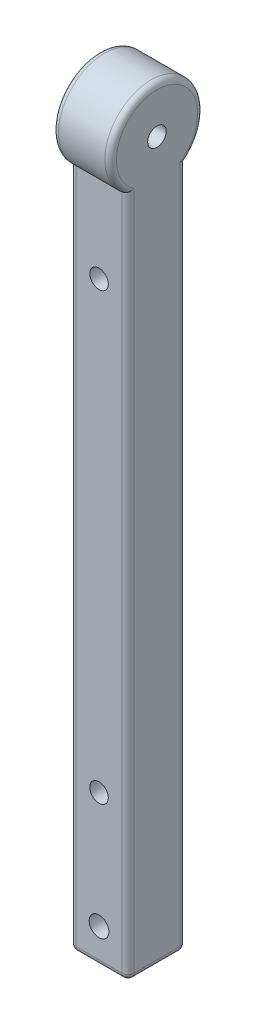
ISO-10303-21;
HEADER;
FILE_DESCRIPTION(('STEP AP214'),'2;1');
FILE_NAME('part.step','',(''),(''),'','','');
FILE_SCHEMA(('AUTOMOTIVE_DESIGN { 1 0 10303 214 1 1 1 1 }'));
ENDSEC;
DATA;
#1=APPLICATION_CONTEXT('core data for automotive mechanical design processes');
#2=APPLICATION_PROTOCOL_DEFINITION('international standard','automotive_design',2000,#1);
#3=PRODUCT_CONTEXT('',#1,'mechanical');
#4=PRODUCT('Part','Part','',(#3));
#5=PRODUCT_RELATED_PRODUCT_CATEGORY('part','',(#4));
#6=PRODUCT_DEFINITION_FORMATION('','',#4);
#7=PRODUCT_DEFINITION_CONTEXT('part definition',#1,'design');
#8=PRODUCT_DEFINITION('design','',#6,#7);
#9=PRODUCT_DEFINITION_SHAPE('','',#8);
#10=(LENGTH_UNIT() NAMED_UNIT(*) SI_UNIT(.MILLI.,.METRE.));
#11=(NAMED_UNIT(*) PLANE_ANGLE_UNIT() SI_UNIT($,.RADIAN.));
#12=(NAMED_UNIT(*) SI_UNIT($,.STERADIAN.) SOLID_ANGLE_UNIT());
#13=UNCERTAINTY_MEASURE_WITH_UNIT(LENGTH_MEASURE(1.E-05),#10,'distance_accuracy_value','');
#14=(GEOMETRIC_REPRESENTATION_CONTEXT(3) GLOBAL_UNCERTAINTY_ASSIGNED_CONTEXT((#13)) GLOBAL_UNIT_ASSIGNED_CONTEXT((#10,
#11,#12)) REPRESENTATION_CONTEXT('',''));
#15=CARTESIAN_POINT('',(0.,0.,0.));
#16=DIRECTION('',(0.,0.,1.));
#17=DIRECTION('',(1.,0.,0.));
#18=AXIS2_PLACEMENT_3D('',#15,#16,#17);
#19=CARTESIAN_POINT('',(-90.805,-92.0836050842382,12.7));
#20=DIRECTION('',(0.,1.,0.));
#21=DIRECTION('',(0.,0.,1.));
#22=AXIS2_PLACEMENT_3D('',#19,#20,#21);
#23=PLANE('',#22);
#24=DIRECTION('',(0.,0.,-1.));
#25=VECTOR('',#24,1.);
#26=CARTESIAN_POINT('',(-89.535,-92.0836050842382,12.7));
#27=LINE('',#26,#25);
#28=CARTESIAN_POINT('',(-89.535,-92.0836050842382,11.43));
#29=VERTEX_POINT('',#28);
#30=CARTESIAN_POINT('',(-89.535,-92.0836050842382,1.27));
#31=VERTEX_POINT('',#30);
#32=EDGE_CURVE('E127',#29,#31,#27,.T.);
#33=ORIENTED_EDGE('',*,*,#32,.T.);
#34=DIRECTION('',(1.,0.,0.));
#35=VECTOR('',#34,1.);
#36=CARTESIAN_POINT('',(-90.805,-92.0836050842382,1.27));
#37=LINE('',#36,#35);
#38=CARTESIAN_POINT('',(-79.3749999999999,-92.0836050842382,1.27));
#39=VERTEX_POINT('',#38);
#40=EDGE_CURVE('E129',#31,#39,#37,.T.);
#41=ORIENTED_EDGE('',*,*,#40,.T.);
#42=DIRECTION('',(0.,0.,-1.));
#43=VECTOR('',#42,1.);
#44=CARTESIAN_POINT('',(-79.3749999999999,-92.0836050842382,12.7));
#45=LINE('',#44,#43);
#46=CARTESIAN_POINT('',(-79.3749999999999,-92.0836050842382,11.43));
#47=VERTEX_POINT('',#46);
#48=EDGE_CURVE('E122',#39,#47,#45,.F.);
#49=ORIENTED_EDGE('',*,*,#48,.T.);
#50=DIRECTION('',(1.,0.,0.));
#51=VECTOR('',#50,1.);
#52=CARTESIAN_POINT('',(-90.805,-92.0836050842382,11.43));
#53=LINE('',#52,#51);
#54=EDGE_CURVE('E124',#47,#29,#53,.F.);
#55=ORIENTED_EDGE('',*,*,#54,.T.);
#56=EDGE_LOOP('',(#33,#41,#49,#55));
#57=FACE_BOUND('',#56,.T.);
#58=ADVANCED_FACE('F43',(#57),#23,.F.);
#59=CARTESIAN_POINT('',(-78.1049999999999,-92.0836050842382,12.7));
#60=DIRECTION('',(-1.,0.,0.));
#61=DIRECTION('',(0.,0.,1.));
#62=AXIS2_PLACEMENT_3D('',#59,#60,#61);
#63=PLANE('',#62);
#64=DIRECTION('',(0.,0.,-1.));
#65=VECTOR('',#64,1.);
#66=CARTESIAN_POINT('',(-78.1049999999999,-90.8136050842382,12.7));
#67=LINE('',#66,#65);
#68=CARTESIAN_POINT('',(-78.1049999999999,-90.8136050842382,11.43));
#69=VERTEX_POINT('',#68);
#70=CARTESIAN_POINT('',(-78.1049999999999,-90.8136050842382,1.27));
#71=VERTEX_POINT('',#70);
#72=EDGE_CURVE('E154',#69,#71,#67,.T.);
#73=ORIENTED_EDGE('',*,*,#72,.T.);
#74=DIRECTION('',(0.,1.,0.));
#75=VECTOR('',#74,1.);
#76=CARTESIAN_POINT('',(-78.1049999999999,-92.0836050842382,1.27));
#77=LINE('',#76,#75);
#78=CARTESIAN_POINT('',(-78.1049999999999,58.1008003546585,1.27));
#79=VERTEX_POINT('',#78);
#80=EDGE_CURVE('E335',#71,#79,#77,.T.);
#81=ORIENTED_EDGE('',*,*,#80,.T.);
#82=CARTESIAN_POINT('',(-78.1049999999999,65.3963949157618,6.35));
#83=DIRECTION('',(-1.,0.,0.));
#84=DIRECTION('',(0.,0.,1.));
#85=AXIS2_PLACEMENT_3D('',#82,#83,#84);
#86=CIRCLE('',#85,8.89);
#87=CARTESIAN_POINT('',(-78.1049999999999,58.1008003546585,11.43));
#88=VERTEX_POINT('',#87);
#89=EDGE_CURVE('E327',#79,#88,#86,.F.);
#90=ORIENTED_EDGE('',*,*,#89,.T.);
#91=DIRECTION('',(0.,1.,0.));
#92=VECTOR('',#91,1.);
#93=CARTESIAN_POINT('',(-78.1049999999999,-92.0836050842382,11.43));
#94=LINE('',#93,#92);
#95=EDGE_CURVE('E321',#88,#69,#94,.F.);
#96=ORIENTED_EDGE('',*,*,#95,.T.);
#97=EDGE_LOOP('',(#73,#81,#90,#96));
#98=FACE_BOUND('',#97,.T.);
#99=CARTESIAN_POINT('',(-78.1049999999999,65.3963949157618,6.35));
#100=DIRECTION('',(-1.,0.,0.));
#101=DIRECTION('',(0.,0.,1.));
#102=AXIS2_PLACEMENT_3D('',#99,#100,#101);
#103=CIRCLE('',#102,2.032);
#104=CARTESIAN_POINT('',(-78.1049999999999,65.3963949157618,8.382));
#105=VERTEX_POINT('',#104);
#106=EDGE_CURVE('E347',#105,#105,#103,.T.);
#107=ORIENTED_EDGE('',*,*,#106,.T.);
#108=EDGE_LOOP('',(#107));
#109=FACE_BOUND('',#108,.T.);
#110=ADVANCED_FACE('F221',(#98,#109),#63,.F.);
#111=CARTESIAN_POINT('',(-90.805,73.0163949157618,12.7));
#112=DIRECTION('',(1.,0.,0.));
#113=DIRECTION('',(0.,0.,-1.));
#114=AXIS2_PLACEMENT_3D('',#111,#112,#113);
#115=PLANE('',#114);
#116=DIRECTION('',(0.,-1.,0.));
#117=VECTOR('',#116,1.);
#118=CARTESIAN_POINT('',(-90.805,73.0163949157618,1.27));
#119=LINE('',#118,#117);
#120=CARTESIAN_POINT('',(-90.805,58.1008003546585,1.27));
#121=VERTEX_POINT('',#120);
#122=CARTESIAN_POINT('',(-90.805,-90.8136050842382,1.27));
#123=VERTEX_POINT('',#122);
#124=EDGE_CURVE('E279',#121,#123,#119,.T.);
#125=ORIENTED_EDGE('',*,*,#124,.T.);
#126=DIRECTION('',(0.,0.,-1.));
#127=VECTOR('',#126,1.);
#128=CARTESIAN_POINT('',(-90.805,-90.8136050842382,12.7));
#129=LINE('',#128,#127);
#130=CARTESIAN_POINT('',(-90.805,-90.8136050842382,11.43));
#131=VERTEX_POINT('',#130);
#132=EDGE_CURVE('E270',#123,#131,#129,.F.);
#133=ORIENTED_EDGE('',*,*,#132,.T.);
#134=DIRECTION('',(0.,-1.,0.));
#135=VECTOR('',#134,1.);
#136=CARTESIAN_POINT('',(-90.805,57.4652474577958,11.43));
#137=LINE('',#136,#135);
#138=CARTESIAN_POINT('',(-90.805,58.1008003546585,11.43));
#139=VERTEX_POINT('',#138);
#140=EDGE_CURVE('E275',#131,#139,#137,.F.);
#141=ORIENTED_EDGE('',*,*,#140,.T.);
#142=CARTESIAN_POINT('',(-90.805,65.3963949157618,6.35));
#143=DIRECTION('',(1.,0.,0.));
#144=DIRECTION('',(0.,0.,-1.));
#145=AXIS2_PLACEMENT_3D('',#142,#143,#144);
#146=CIRCLE('',#145,8.89);
#147=EDGE_CURVE('E332',#139,#121,#146,.F.);
#148=ORIENTED_EDGE('',*,*,#147,.T.);
#149=EDGE_LOOP('',(#125,#133,#141,#148));
#150=FACE_BOUND('',#149,.T.);
#151=CARTESIAN_POINT('',(-90.805,65.3963949157618,6.35));
#152=DIRECTION('',(-1.,0.,0.));
#153=DIRECTION('',(0.,0.,1.));
#154=AXIS2_PLACEMENT_3D('',#151,#152,#153);
#155=CIRCLE('',#154,2.032);
#156=CARTESIAN_POINT('',(-90.805,65.3963949157618,8.382));
#157=VERTEX_POINT('',#156);
#158=EDGE_CURVE('E348',#157,#157,#155,.T.);
#159=ORIENTED_EDGE('',*,*,#158,.F.);
#160=EDGE_LOOP('',(#159));
#161=FACE_BOUND('',#160,.T.);
#162=ADVANCED_FACE('F229',(#150,#161),#115,.F.);
#163=CARTESIAN_POINT('',(0.,0.,12.7));
#164=DIRECTION('',(0.,0.,1.));
#165=DIRECTION('',(1.,0.,0.));
#166=AXIS2_PLACEMENT_3D('',#163,#164,#165);
#167=PLANE('',#166);
#168=CARTESIAN_POINT('',(-84.455,38.4152474577958,12.7));
#169=DIRECTION('',(0.,0.,1.));
#170=DIRECTION('',(1.,0.,0.));
#171=AXIS2_PLACEMENT_3D('',#168,#169,#170);
#172=CIRCLE('',#171,2.03200000000001);
#173=CARTESIAN_POINT('',(-82.423,38.4152474577958,12.7));
#174=VERTEX_POINT('',#173);
#175=EDGE_CURVE('E339',#174,#174,#172,.T.);
#176=ORIENTED_EDGE('',*,*,#175,.F.);
#177=EDGE_LOOP('',(#176));
#178=FACE_BOUND('',#177,.T.);
#179=CARTESIAN_POINT('',(-84.455,-59.0636050842382,12.7));
#180=DIRECTION('',(0.,0.,1.));
#181=DIRECTION('',(1.,0.,0.));
#182=AXIS2_PLACEMENT_3D('',#179,#180,#181);
#183=CIRCLE('',#182,2.03200000000001);
#184=CARTESIAN_POINT('',(-82.423,-59.0636050842382,12.7));
#185=VERTEX_POINT('',#184);
#186=EDGE_CURVE('E341',#185,#185,#183,.T.);
#187=ORIENTED_EDGE('',*,*,#186,.F.);
#188=EDGE_LOOP('',(#187));
#189=FACE_BOUND('',#188,.T.);
#190=CARTESIAN_POINT('',(-84.455,-84.4636050842382,12.7));
#191=DIRECTION('',(0.,0.,1.));
#192=DIRECTION('',(1.,0.,0.));
#193=AXIS2_PLACEMENT_3D('',#190,#191,#192);
#194=CIRCLE('',#193,2.15899999999999);
#195=CARTESIAN_POINT('',(-82.296,-84.4636050842382,12.7));
#196=VERTEX_POINT('',#195);
#197=EDGE_CURVE('E204',#196,#196,#194,.T.);
#198=ORIENTED_EDGE('',*,*,#197,.F.);
#199=EDGE_LOOP('',(#198));
#200=FACE_BOUND('',#199,.T.);
#201=DIRECTION('',(1.,0.,0.));
#202=VECTOR('',#201,1.);
#203=CARTESIAN_POINT('',(-78.1049999999999,-90.8136050842382,12.7));
#204=LINE('',#203,#202);
#205=CARTESIAN_POINT('',(-89.535,-90.8136050842382,12.7));
#206=VERTEX_POINT('',#205);
#207=CARTESIAN_POINT('',(-79.3749999999999,-90.8136050842382,12.7));
#208=VERTEX_POINT('',#207);
#209=EDGE_CURVE('E64',#206,#208,#204,.T.);
#210=ORIENTED_EDGE('',*,*,#209,.T.);
#211=DIRECTION('',(0.,1.,0.));
#212=VECTOR('',#211,1.);
#213=CARTESIAN_POINT('',(-79.3749999999999,57.4652474577958,12.7));
#214=LINE('',#213,#212);
#215=CARTESIAN_POINT('',(-79.3749999999999,57.4652474577958,12.7));
#216=VERTEX_POINT('',#215);
#217=EDGE_CURVE('E288',#208,#216,#214,.T.);
#218=ORIENTED_EDGE('',*,*,#217,.T.);
#219=DIRECTION('',(-1.,0.,0.));
#220=VECTOR('',#219,1.);
#221=CARTESIAN_POINT('',(-49.3681804125787,57.4652474577958,12.7));
#222=LINE('',#221,#220);
#223=CARTESIAN_POINT('',(-89.535,57.4652474577958,12.7));
#224=VERTEX_POINT('',#223);
#225=EDGE_CURVE('E354',#224,#216,#222,.F.);
#226=ORIENTED_EDGE('',*,*,#225,.F.);
#227=DIRECTION('',(0.,-1.,0.));
#228=VECTOR('',#227,1.);
#229=CARTESIAN_POINT('',(-89.535,-92.0836050842382,12.7));
#230=LINE('',#229,#228);
#231=EDGE_CURVE('E68',#224,#206,#230,.T.);
#232=ORIENTED_EDGE('',*,*,#231,.T.);
#233=EDGE_LOOP('',(#210,#218,#226,#232));
#234=FACE_BOUND('',#233,.T.);
#235=ADVANCED_FACE('F372',(#178,#189,#200,#234),#167,.T.);
#236=CARTESIAN_POINT('',(0.,0.,0.));
#237=DIRECTION('',(0.,0.,1.));
#238=DIRECTION('',(1.,0.,0.));
#239=AXIS2_PLACEMENT_3D('',#236,#237,#238);
#240=PLANE('',#239);
#241=CARTESIAN_POINT('',(-84.455,38.4152474577958,0.));
#242=DIRECTION('',(0.,0.,1.));
#243=DIRECTION('',(1.,0.,0.));
#244=AXIS2_PLACEMENT_3D('',#241,#242,#243);
#245=CIRCLE('',#244,2.03200000000001);
#246=CARTESIAN_POINT('',(-82.423,38.4152474577958,0.));
#247=VERTEX_POINT('',#246);
#248=EDGE_CURVE('E50',#247,#247,#245,.T.);
#249=ORIENTED_EDGE('',*,*,#248,.T.);
#250=EDGE_LOOP('',(#249));
#251=FACE_BOUND('',#250,.T.);
#252=CARTESIAN_POINT('',(-84.455,-59.0636050842382,0.));
#253=DIRECTION('',(0.,0.,1.));
#254=DIRECTION('',(1.,0.,0.));
#255=AXIS2_PLACEMENT_3D('',#252,#253,#254);
#256=CIRCLE('',#255,2.03200000000001);
#257=CARTESIAN_POINT('',(-82.423,-59.0636050842382,0.));
#258=VERTEX_POINT('',#257);
#259=EDGE_CURVE('E210',#258,#258,#256,.T.);
#260=ORIENTED_EDGE('',*,*,#259,.T.);
#261=EDGE_LOOP('',(#260));
#262=FACE_BOUND('',#261,.T.);
#263=CARTESIAN_POINT('',(-84.455,-84.4636050842382,0.));
#264=DIRECTION('',(0.,0.,1.));
#265=DIRECTION('',(1.,0.,0.));
#266=AXIS2_PLACEMENT_3D('',#263,#264,#265);
#267=CIRCLE('',#266,2.15899999999999);
#268=CARTESIAN_POINT('',(-82.296,-84.4636050842382,0.));
#269=VERTEX_POINT('',#268);
#270=EDGE_CURVE('E350',#269,#269,#267,.T.);
#271=ORIENTED_EDGE('',*,*,#270,.T.);
#272=EDGE_LOOP('',(#271));
#273=FACE_BOUND('',#272,.T.);
#274=DIRECTION('',(-1.,0.,0.));
#275=VECTOR('',#274,1.);
#276=CARTESIAN_POINT('',(-49.3681804125787,57.4652474577958,0.));
#277=LINE('',#276,#275);
#278=CARTESIAN_POINT('',(-89.535,57.4652474577958,0.));
#279=VERTEX_POINT('',#278);
#280=CARTESIAN_POINT('',(-79.3749999999999,57.4652474577958,0.));
#281=VERTEX_POINT('',#280);
#282=EDGE_CURVE('E137',#279,#281,#277,.F.);
#283=ORIENTED_EDGE('',*,*,#282,.T.);
#284=DIRECTION('',(0.,1.,0.));
#285=VECTOR('',#284,1.);
#286=CARTESIAN_POINT('',(-79.3749999999999,0.,0.));
#287=LINE('',#286,#285);
#288=CARTESIAN_POINT('',(-79.3749999999999,-90.8136050842382,0.));
#289=VERTEX_POINT('',#288);
#290=EDGE_CURVE('E320',#281,#289,#287,.F.);
#291=ORIENTED_EDGE('',*,*,#290,.T.);
#292=DIRECTION('',(1.,0.,0.));
#293=VECTOR('',#292,1.);
#294=CARTESIAN_POINT('',(0.,-90.8136050842382,0.));
#295=LINE('',#294,#293);
#296=CARTESIAN_POINT('',(-89.535,-90.8136050842382,0.));
#297=VERTEX_POINT('',#296);
#298=EDGE_CURVE('E315',#289,#297,#295,.F.);
#299=ORIENTED_EDGE('',*,*,#298,.T.);
#300=DIRECTION('',(0.,-1.,0.));
#301=VECTOR('',#300,1.);
#302=CARTESIAN_POINT('',(-89.535,0.,0.));
#303=LINE('',#302,#301);
#304=EDGE_CURVE('E304',#297,#279,#303,.F.);
#305=ORIENTED_EDGE('',*,*,#304,.T.);
#306=EDGE_LOOP('',(#283,#291,#299,#305));
#307=FACE_BOUND('',#306,.T.);
#308=ADVANCED_FACE('F314',(#251,#262,#273,#307),#240,.F.);
#309=CARTESIAN_POINT('',(-49.3681804125787,65.3963949157618,6.35));
#310=DIRECTION('',(-1.,0.,0.));
#311=DIRECTION('',(0.,0.,1.));
#312=AXIS2_PLACEMENT_3D('',#309,#310,#311);
#313=CYLINDRICAL_SURFACE('',#312,10.16);
#314=ORIENTED_EDGE('',*,*,#225,.T.);
#315=CARTESIAN_POINT('',(-79.3749999999999,65.3963949157618,6.35));
#316=DIRECTION('',(-1.,0.,0.));
#317=DIRECTION('',(0.,0.,1.));
#318=AXIS2_PLACEMENT_3D('',#315,#316,#317);
#319=CIRCLE('',#318,10.16);
#320=EDGE_CURVE('E11',#216,#281,#319,.T.);
#321=ORIENTED_EDGE('',*,*,#320,.T.);
#322=ORIENTED_EDGE('',*,*,#282,.F.);
#323=CARTESIAN_POINT('',(-89.535,65.3963949157618,6.35));
#324=DIRECTION('',(1.,0.,0.));
#325=DIRECTION('',(0.,0.,-1.));
#326=AXIS2_PLACEMENT_3D('',#323,#324,#325);
#327=CIRCLE('',#326,10.16);
#328=EDGE_CURVE('E52',#279,#224,#327,.T.);
#329=ORIENTED_EDGE('',*,*,#328,.T.);
#330=EDGE_LOOP('',(#314,#321,#322,#329));
#331=FACE_BOUND('',#330,.T.);
#332=ADVANCED_FACE('F374',(#331),#313,.T.);
#333=CARTESIAN_POINT('',(-78.1049999999999,65.3963949157618,6.35));
#334=DIRECTION('',(-1.,0.,0.));
#335=DIRECTION('',(0.,0.,1.));
#336=AXIS2_PLACEMENT_3D('',#333,#334,#335);
#337=CYLINDRICAL_SURFACE('',#336,2.032);
#338=CARTESIAN_POINT('',(-78.1049999999999,65.3963949157618,8.382));
#339=CARTESIAN_POINT('',(-78.2372916666666,65.3963949157618,8.382));
#340=CARTESIAN_POINT('',(-78.3695833333333,65.3963949157618,8.382));
#341=CARTESIAN_POINT('',(-78.6341666666666,65.3963949157618,8.382));
#342=CARTESIAN_POINT('',(-78.7664583333333,65.3963949157618,8.382));
#343=CARTESIAN_POINT('',(-79.0310416666666,65.3963949157618,8.382));
#344=CARTESIAN_POINT('',(-79.1633333333333,65.3963949157618,8.382));
#345=CARTESIAN_POINT('',(-79.4279166666666,65.3963949157618,8.382));
#346=CARTESIAN_POINT('',(-79.5602083333333,65.3963949157618,8.382));
#347=CARTESIAN_POINT('',(-79.8247916666666,65.3963949157618,8.382));
#348=CARTESIAN_POINT('',(-79.9570833333333,65.3963949157618,8.382));
#349=CARTESIAN_POINT('',(-80.2216666666666,65.3963949157618,8.382));
#350=CARTESIAN_POINT('',(-80.3539583333333,65.3963949157618,8.382));
#351=CARTESIAN_POINT('',(-80.6185416666666,65.3963949157618,8.382));
#352=CARTESIAN_POINT('',(-80.7508333333333,65.3963949157618,8.382));
#353=CARTESIAN_POINT('',(-81.0154166666666,65.3963949157618,8.382));
#354=CARTESIAN_POINT('',(-81.1477083333333,65.3963949157618,8.382));
#355=CARTESIAN_POINT('',(-81.4122916666666,65.3963949157618,8.382));
#356=CARTESIAN_POINT('',(-81.5445833333333,65.3963949157618,8.382));
#357=CARTESIAN_POINT('',(-81.8091666666666,65.3963949157618,8.382));
#358=CARTESIAN_POINT('',(-81.9414583333333,65.3963949157618,8.382));
#359=CARTESIAN_POINT('',(-82.2060416666666,65.3963949157618,8.382));
#360=CARTESIAN_POINT('',(-82.3383333333333,65.3963949157618,8.382));
#361=CARTESIAN_POINT('',(-82.6029166666666,65.3963949157618,8.382));
#362=CARTESIAN_POINT('',(-82.7352083333333,65.3963949157618,8.382));
#363=CARTESIAN_POINT('',(-82.9997916666666,65.3963949157618,8.382));
#364=CARTESIAN_POINT('',(-83.1320833333333,65.3963949157618,8.382));
#365=CARTESIAN_POINT('',(-83.3966666666666,65.3963949157618,8.382));
#366=CARTESIAN_POINT('',(-83.5289583333333,65.3963949157618,8.382));
#367=CARTESIAN_POINT('',(-83.7935416666666,65.3963949157618,8.382));
#368=CARTESIAN_POINT('',(-83.9258333333333,65.3963949157618,8.382));
#369=CARTESIAN_POINT('',(-84.1904166666666,65.3963949157618,8.382));
#370=CARTESIAN_POINT('',(-84.3227083333333,65.3963949157618,8.382));
#371=CARTESIAN_POINT('',(-84.5872916666666,65.3963949157618,8.382));
#372=CARTESIAN_POINT('',(-84.7195833333333,65.3963949157618,8.382));
#373=CARTESIAN_POINT('',(-84.9841666666666,65.3963949157618,8.382));
#374=CARTESIAN_POINT('',(-85.1164583333333,65.3963949157618,8.382));
#375=CARTESIAN_POINT('',(-85.3810416666666,65.3963949157618,8.382));
#376=CARTESIAN_POINT('',(-85.5133333333333,65.3963949157618,8.382));
#377=CARTESIAN_POINT('',(-85.7779166666666,65.3963949157618,8.382));
#378=CARTESIAN_POINT('',(-85.9102083333333,65.3963949157618,8.382));
#379=CARTESIAN_POINT('',(-86.1747916666666,65.3963949157618,8.382));
#380=CARTESIAN_POINT('',(-86.3070833333333,65.3963949157618,8.382));
#381=CARTESIAN_POINT('',(-86.5716666666666,65.3963949157618,8.382));
#382=CARTESIAN_POINT('',(-86.7039583333333,65.3963949157618,8.382));
#383=CARTESIAN_POINT('',(-86.9685416666666,65.3963949157618,8.382));
#384=CARTESIAN_POINT('',(-87.1008333333333,65.3963949157618,8.382));
#385=CARTESIAN_POINT('',(-87.3654166666666,65.3963949157618,8.382));
#386=CARTESIAN_POINT('',(-87.4977083333333,65.3963949157618,8.382));
#387=CARTESIAN_POINT('',(-87.7622916666666,65.3963949157618,8.382));
#388=CARTESIAN_POINT('',(-87.8945833333333,65.3963949157618,8.382));
#389=CARTESIAN_POINT('',(-88.1591666666666,65.3963949157618,8.382));
#390=CARTESIAN_POINT('',(-88.2914583333333,65.3963949157618,8.382));
#391=CARTESIAN_POINT('',(-88.5560416666666,65.3963949157618,8.382));
#392=CARTESIAN_POINT('',(-88.6883333333333,65.3963949157618,8.382));
#393=CARTESIAN_POINT('',(-88.9529166666666,65.3963949157618,8.382));
#394=CARTESIAN_POINT('',(-89.0852083333333,65.3963949157618,8.382));
#395=CARTESIAN_POINT('',(-89.3497916666666,65.3963949157618,8.382));
#396=CARTESIAN_POINT('',(-89.4820833333333,65.3963949157618,8.382));
#397=CARTESIAN_POINT('',(-89.7466666666666,65.3963949157618,8.382));
#398=CARTESIAN_POINT('',(-89.8789583333333,65.3963949157618,8.382));
#399=CARTESIAN_POINT('',(-90.1435416666666,65.3963949157618,8.382));
#400=CARTESIAN_POINT('',(-90.2758333333333,65.3963949157618,8.382));
#401=CARTESIAN_POINT('',(-90.5404166666666,65.3963949157618,8.382));
#402=CARTESIAN_POINT('',(-90.6727083333333,65.3963949157618,8.382));
#403=CARTESIAN_POINT('',(-90.805,65.3963949157618,8.382));
#404=B_SPLINE_CURVE_WITH_KNOTS('',3,(#338,#339,#340,#341,#342,#343,#344,#345,#346,#347,#348,
#349,#350,#351,#352,#353,#354,#355,#356,#357,#358,#359,#360,#361,#362,#363,#364,#365,#366,#367,
#368,#369,#370,#371,#372,#373,#374,#375,#376,#377,#378,#379,#380,#381,#382,#383,#384,#385,#386,
#387,#388,#389,#390,#391,#392,#393,#394,#395,#396,#397,#398,#399,#400,#401,#402,#403),
.UNSPECIFIED.,.F.,.F.,(4,2,2,2,2,2,2,2,2,2,2,2,2,2,2,2,2,2,2,2,2,2,2,2,2,2,2,2,2,2,2,2,4),(0.,
0.396874999999991,0.793749999999996,1.190625,1.58749999999999,1.984375,2.38125,2.77812500000001,
3.175,3.571875,3.96875000000001,4.365625,4.7625,5.15937500000001,5.55625000000001,5.953125,
6.35000000000001,6.74687500000001,7.14375,7.54062500000001,7.93750000000001,8.33437500000002,
8.73125000000001,9.12812500000001,9.52500000000002,9.92187500000002,10.31875,10.715625,11.1125,
11.509375,11.90625,12.303125,12.7),.UNSPECIFIED.);
#405=EDGE_CURVE('BSEAM380',#105,#157,#404,.T.);
#406=ORIENTED_EDGE('',*,*,#106,.F.);
#407=ORIENTED_EDGE('',*,*,#158,.T.);
#408=ORIENTED_EDGE('',*,*,#405,.T.);
#409=ORIENTED_EDGE('',*,*,#405,.F.);
#410=EDGE_LOOP('',(#406,#408,#407,#409));
#411=FACE_BOUND('',#410,.T.);
#412=ADVANCED_FACE('F380',(#411),#337,.F.);
#413=CARTESIAN_POINT('',(-84.455,-84.4636050842382,-3.81));
#414=DIRECTION('',(0.,0.,1.));
#415=DIRECTION('',(1.,0.,0.));
#416=AXIS2_PLACEMENT_3D('',#413,#414,#415);
#417=CYLINDRICAL_SURFACE('',#416,2.15899999999999);
#418=ORIENTED_EDGE('',*,*,#197,.T.);
#419=EDGE_LOOP('',(#418));
#420=FACE_BOUND('',#419,.T.);
#421=ORIENTED_EDGE('',*,*,#270,.F.);
#422=EDGE_LOOP('',(#421));
#423=FACE_BOUND('',#422,.T.);
#424=ADVANCED_FACE('F211',(#420,#423),#417,.F.);
#425=CARTESIAN_POINT('',(-89.535,0.,11.43));
#426=DIRECTION('',(0.,1.,0.));
#427=DIRECTION('',(0.,0.,1.));
#428=AXIS2_PLACEMENT_3D('',#425,#426,#427);
#429=CYLINDRICAL_SURFACE('',#428,1.27);
#430=CARTESIAN_POINT('',(-89.535,-90.8136050842382,11.43));
#431=DIRECTION('',(0.,-1.,0.));
#432=DIRECTION('',(0.,0.,-1.));
#433=AXIS2_PLACEMENT_3D('',#430,#431,#432);
#434=CIRCLE('',#433,1.27);
#435=EDGE_CURVE('E202',#206,#131,#434,.T.);
#436=ORIENTED_EDGE('',*,*,#435,.F.);
#437=ORIENTED_EDGE('',*,*,#231,.F.);
#438=CARTESIAN_POINT('',(-89.535,57.4652474577958,12.7));
#439=CARTESIAN_POINT('',(-89.5681509847707,57.4652470164815,12.7000014182025));
#440=CARTESIAN_POINT('',(-89.6012851414134,57.4658714363844,12.6987010326598));
#441=CARTESIAN_POINT('',(-89.6672969559624,57.4683587469162,12.693524302991));
#442=CARTESIAN_POINT('',(-89.700174673441,57.4702213406822,12.6896485763256));
#443=CARTESIAN_POINT('',(-89.7978446616233,57.4776296156586,12.6742412174657));
#444=CARTESIAN_POINT('',(-89.8619496642028,57.4849960107391,12.6589288829333));
#445=CARTESIAN_POINT('',(-89.9863346647674,57.5042992813401,12.6188952415443));
#446=CARTESIAN_POINT('',(-90.046616334415,57.5162341431222,12.5941780802782));
#447=CARTESIAN_POINT('',(-90.1619736613903,57.5442525222558,12.5363312949366));
#448=CARTESIAN_POINT('',(-90.2170466243818,57.5603381708416,12.5031973493739));
#449=CARTESIAN_POINT('',(-90.3227660368385,57.5968195571166,12.4283374863542));
#450=CARTESIAN_POINT('',(-90.3731675263155,57.6173548526557,12.3863348824959));
#451=CARTESIAN_POINT('',(-90.4662190866392,57.6617299438144,12.295990833664));
#452=CARTESIAN_POINT('',(-90.5088669868936,57.685570661494,12.2476476201572));
#453=CARTESIAN_POINT('',(-90.5894389578892,57.7383019974809,12.1412769051853));
#454=CARTESIAN_POINT('',(-90.6265522462378,57.7674561837534,12.0827667450368));
#455=CARTESIAN_POINT('',(-90.6904588045414,57.828249381418,11.9615226380821));
#456=CARTESIAN_POINT('',(-90.7172444603499,57.8598902054979,11.8987856148583));
#457=CARTESIAN_POINT('',(-90.7605207843608,57.9252367696498,11.7700821215857));
#458=CARTESIAN_POINT('',(-90.7769091587923,57.9589595505291,11.7040902451844));
#459=CARTESIAN_POINT('',(-90.7989443717157,58.027455218464,11.570997844177));
#460=CARTESIAN_POINT('',(-90.8046129646147,58.0622258329873,11.5038998442164));
#461=CARTESIAN_POINT('',(-90.8049936297755,58.0983725893593,11.4346493922543));
#462=CARTESIAN_POINT('',(-90.805000012835,58.0995863822028,11.432324575383));
#463=CARTESIAN_POINT('',(-90.805,58.1008003546585,11.43));
#464=B_SPLINE_CURVE_WITH_KNOTS('',3,(#438,#439,#440,#441,#442,#443,#444,#445,#446,#447,#448,
#449,#450,#451,#452,#453,#454,#455,#456,#457,#458,#459,#460,#461,#462,#463),.UNSPECIFIED.,.F.,
.F.,(4,2,2,2,2,2,2,2,2,2,2,2,4),(0.,0.0993886325875938,0.198753444472587,0.396666451883667,
0.594492321316693,0.792419967867333,0.99780500508972,1.20324745095249,1.42783829317566,
1.65259440197949,1.87952881880916,2.10600220537238,2.11387001204624),.UNSPECIFIED.);
#465=EDGE_CURVE('E199',#139,#224,#464,.F.);
#466=ORIENTED_EDGE('',*,*,#465,.F.);
#467=ORIENTED_EDGE('',*,*,#140,.F.);
#468=EDGE_LOOP('',(#436,#437,#466,#467));
#469=FACE_BOUND('',#468,.T.);
#470=ADVANCED_FACE('F206',(#469),#429,.T.);
#471=CARTESIAN_POINT('',(0.,-90.8136050842382,11.43));
#472=DIRECTION('',(-1.,0.,0.));
#473=DIRECTION('',(0.,0.,1.));
#474=AXIS2_PLACEMENT_3D('',#471,#472,#473);
#475=CYLINDRICAL_SURFACE('',#474,1.27);
#476=CARTESIAN_POINT('',(-79.3749999999999,-90.8136050842382,11.43));
#477=DIRECTION('',(1.,0.,0.));
#478=DIRECTION('',(0.,0.,-1.));
#479=AXIS2_PLACEMENT_3D('',#476,#477,#478);
#480=CIRCLE('',#479,1.27);
#481=EDGE_CURVE('E131',#208,#47,#480,.T.);
#482=ORIENTED_EDGE('',*,*,#481,.F.);
#483=ORIENTED_EDGE('',*,*,#209,.F.);
#484=CARTESIAN_POINT('',(-89.535,-90.8136050842382,11.43));
#485=DIRECTION('',(-1.,0.,0.));
#486=DIRECTION('',(0.,0.,1.));
#487=AXIS2_PLACEMENT_3D('',#484,#485,#486);
#488=CIRCLE('',#487,1.27);
#489=EDGE_CURVE('E136',#29,#206,#488,.T.);
#490=ORIENTED_EDGE('',*,*,#489,.F.);
#491=ORIENTED_EDGE('',*,*,#54,.F.);
#492=EDGE_LOOP('',(#482,#483,#490,#491));
#493=FACE_BOUND('',#492,.T.);
#494=ADVANCED_FACE('F44',(#493),#475,.T.);
#495=CARTESIAN_POINT('',(-79.3749999999999,0.,11.43));
#496=DIRECTION('',(0.,-1.,0.));
#497=DIRECTION('',(0.,0.,-1.));
#498=AXIS2_PLACEMENT_3D('',#495,#496,#497);
#499=CYLINDRICAL_SURFACE('',#498,1.27);
#500=CARTESIAN_POINT('',(-79.3749999999999,57.4652474577958,12.7));
#501=CARTESIAN_POINT('',(-79.3418490152292,57.4652470164815,12.7000014182025));
#502=CARTESIAN_POINT('',(-79.3087148585865,57.4658714363844,12.6987010326598));
#503=CARTESIAN_POINT('',(-79.2427030440376,57.4683587469162,12.693524302991));
#504=CARTESIAN_POINT('',(-79.209825326559,57.4702213406822,12.6896485763256));
#505=CARTESIAN_POINT('',(-79.1121553383766,57.4776296156586,12.6742412174657));
#506=CARTESIAN_POINT('',(-79.0480503357972,57.4849960107391,12.6589288829333));
#507=CARTESIAN_POINT('',(-78.9236653352325,57.5042992813401,12.6188952415443));
#508=CARTESIAN_POINT('',(-78.8633836655849,57.5162341431222,12.5941780802782));
#509=CARTESIAN_POINT('',(-78.7480263386096,57.5442525222558,12.5363312949366));
#510=CARTESIAN_POINT('',(-78.6929533756181,57.5603381708416,12.5031973493739));
#511=CARTESIAN_POINT('',(-78.5872339631614,57.5968195571166,12.4283374863542));
#512=CARTESIAN_POINT('',(-78.5368324736844,57.6173548526557,12.3863348824959));
#513=CARTESIAN_POINT('',(-78.4437809133607,57.6617299438144,12.295990833664));
#514=CARTESIAN_POINT('',(-78.4011330131063,57.685570661494,12.2476476201572));
#515=CARTESIAN_POINT('',(-78.3205610421108,57.7383019974809,12.1412769051853));
#516=CARTESIAN_POINT('',(-78.2834477537622,57.7674561837533,12.0827667450368));
#517=CARTESIAN_POINT('',(-78.2195411954585,57.828249381418,11.9615226380821));
#518=CARTESIAN_POINT('',(-78.19275553965,57.8598902054979,11.8987856148583));
#519=CARTESIAN_POINT('',(-78.1494792156391,57.9252367696498,11.7700821215857));
#520=CARTESIAN_POINT('',(-78.1330908412076,57.958959550529,11.7040902451844));
#521=CARTESIAN_POINT('',(-78.1110556282842,58.027455218464,11.570997844177));
#522=CARTESIAN_POINT('',(-78.1053870353853,58.0622258329875,11.5038998442165));
#523=CARTESIAN_POINT('',(-78.1050063702245,58.0983725893593,11.4346493922543));
#524=CARTESIAN_POINT('',(-78.1049999871649,58.0995863822028,11.432324575383));
#525=CARTESIAN_POINT('',(-78.1049999999999,58.1008003546585,11.43));
#526=B_SPLINE_CURVE_WITH_KNOTS('',3,(#500,#501,#502,#503,#504,#505,#506,#507,#508,#509,#510,
#511,#512,#513,#514,#515,#516,#517,#518,#519,#520,#521,#522,#523,#524,#525),.UNSPECIFIED.,.F.,
.F.,(4,2,2,2,2,2,2,2,2,2,2,2,4),(0.,0.0993886325875938,0.198753444472587,0.396666451883667,
0.594492321316693,0.792419967867333,0.997805005089714,1.20324745095249,1.42783829317567,
1.65259440197949,1.87952881880916,2.10600220537239,2.11387001204625),.UNSPECIFIED.);
#527=EDGE_CURVE('E180',#216,#88,#526,.T.);
#528=ORIENTED_EDGE('',*,*,#527,.F.);
#529=ORIENTED_EDGE('',*,*,#217,.F.);
#530=CARTESIAN_POINT('',(-79.3749999999999,-90.8136050842382,11.43));
#531=DIRECTION('',(0.,-1.,0.));
#532=DIRECTION('',(0.,0.,-1.));
#533=AXIS2_PLACEMENT_3D('',#530,#531,#532);
#534=CIRCLE('',#533,1.27);
#535=EDGE_CURVE('E150',#69,#208,#534,.T.);
#536=ORIENTED_EDGE('',*,*,#535,.F.);
#537=ORIENTED_EDGE('',*,*,#95,.F.);
#538=EDGE_LOOP('',(#528,#529,#536,#537));
#539=FACE_BOUND('',#538,.T.);
#540=ADVANCED_FACE('F194',(#539),#499,.T.);
#541=CARTESIAN_POINT('',(-89.535,65.3963949157618,6.35));
#542=DIRECTION('',(1.,0.,0.));
#543=DIRECTION('',(0.,0.,-1.));
#544=AXIS2_PLACEMENT_3D('',#541,#542,#543);
#545=TOROIDAL_SURFACE('',#544,8.89,1.27);
#546=ORIENTED_EDGE('',*,*,#465,.T.);
#547=ORIENTED_EDGE('',*,*,#328,.F.);
#548=CARTESIAN_POINT('',(-89.535,57.4652474577958,0.));
#549=CARTESIAN_POINT('',(-89.5681509847707,57.4652470164815,-1.41820250793446E-06));
#550=CARTESIAN_POINT('',(-89.6012851414134,57.4658714363844,0.00129896734022966));
#551=CARTESIAN_POINT('',(-89.6672969559624,57.4683587469162,0.00647569700899509));
#552=CARTESIAN_POINT('',(-89.700174673441,57.4702213406822,0.0103514236743955));
#553=CARTESIAN_POINT('',(-89.7978446616233,57.4776296156586,0.0257587825342709));
#554=CARTESIAN_POINT('',(-89.8619496642028,57.4849960107391,0.0410711170666682));
#555=CARTESIAN_POINT('',(-89.9863346647674,57.5042992813401,0.0811047584557113));
#556=CARTESIAN_POINT('',(-90.0466163344151,57.5162341431222,0.10582191972183));
#557=CARTESIAN_POINT('',(-90.1619736613904,57.5442525222558,0.163668705063379));
#558=CARTESIAN_POINT('',(-90.2170466243818,57.5603381708416,0.196802650626063));
#559=CARTESIAN_POINT('',(-90.3227660368385,57.5968195571166,0.271662513645837));
#560=CARTESIAN_POINT('',(-90.3731675263155,57.6173548526557,0.313665117504078));
#561=CARTESIAN_POINT('',(-90.4662190866392,57.6617299438144,0.404009166335965));
#562=CARTESIAN_POINT('',(-90.5088669868936,57.685570661494,0.452352379842762));
#563=CARTESIAN_POINT('',(-90.5894389578892,57.738301997481,0.558723094814739));
#564=CARTESIAN_POINT('',(-90.6265522462378,57.7674561837534,0.617233254963169));
#565=CARTESIAN_POINT('',(-90.6904588045414,57.828249381418,0.738477361917869));
#566=CARTESIAN_POINT('',(-90.7172444603499,57.8598902054979,0.801214385141716));
#567=CARTESIAN_POINT('',(-90.7605207843608,57.9252367696498,0.929917878414338));
#568=CARTESIAN_POINT('',(-90.7769091587923,57.9589595505291,0.995909754815555));
#569=CARTESIAN_POINT('',(-90.7989443717157,58.027455218464,1.129002155823));
#570=CARTESIAN_POINT('',(-90.8046129646147,58.0622258329873,1.19610015578357));
#571=CARTESIAN_POINT('',(-90.8049936297755,58.0983725893593,1.26535060774569));
#572=CARTESIAN_POINT('',(-90.805000012835,58.0995863822028,1.26767542461701));
#573=CARTESIAN_POINT('',(-90.805,58.1008003546585,1.27));
#574=B_SPLINE_CURVE_WITH_KNOTS('',3,(#548,#549,#550,#551,#552,#553,#554,#555,#556,#557,#558,
#559,#560,#561,#562,#563,#564,#565,#566,#567,#568,#569,#570,#571,#572,#573),.UNSPECIFIED.,.F.,
.F.,(4,2,2,2,2,2,2,2,2,2,2,2,4),(0.,0.0993886325875938,0.198753444472587,0.396666451883667,
0.594492321316725,0.79241996786735,0.997805005089722,1.20324745095249,1.42783829317566,
1.65259440197949,1.87952881880916,2.10600220537238,2.11387001204624),.UNSPECIFIED.);
#575=EDGE_CURVE('E158',#121,#279,#574,.F.);
#576=ORIENTED_EDGE('',*,*,#575,.F.);
#577=ORIENTED_EDGE('',*,*,#147,.F.);
#578=EDGE_LOOP('',(#546,#547,#576,#577));
#579=FACE_BOUND('',#578,.T.);
#580=ADVANCED_FACE('F190',(#579),#545,.T.);
#581=CARTESIAN_POINT('',(-89.535,-90.8136050842382,11.43));
#582=DIRECTION('',(0.,0.,1.));
#583=DIRECTION('',(1.,0.,0.));
#584=AXIS2_PLACEMENT_3D('',#581,#582,#583);
#585=SPHERICAL_SURFACE('',#584,1.27);
#586=ORIENTED_EDGE('',*,*,#489,.T.);
#587=ORIENTED_EDGE('',*,*,#435,.T.);
#588=CARTESIAN_POINT('',(-89.535,-90.8136050842382,11.43));
#589=DIRECTION('',(0.,0.,1.));
#590=DIRECTION('',(1.,0.,0.));
#591=AXIS2_PLACEMENT_3D('',#588,#589,#590);
#592=CIRCLE('',#591,1.27);
#593=EDGE_CURVE('E152',#29,#131,#592,.F.);
#594=ORIENTED_EDGE('',*,*,#593,.F.);
#595=EDGE_LOOP('',(#586,#587,#594));
#596=FACE_BOUND('',#595,.T.);
#597=ADVANCED_FACE('F188',(#596),#585,.T.);
#598=CARTESIAN_POINT('',(-79.3749999999999,-90.8136050842382,11.43));
#599=DIRECTION('',(0.,0.,1.));
#600=DIRECTION('',(1.,0.,0.));
#601=AXIS2_PLACEMENT_3D('',#598,#599,#600);
#602=SPHERICAL_SURFACE('',#601,1.27);
#603=ORIENTED_EDGE('',*,*,#535,.T.);
#604=ORIENTED_EDGE('',*,*,#481,.T.);
#605=CARTESIAN_POINT('',(-79.3749999999999,-90.8136050842382,11.43));
#606=DIRECTION('',(0.,0.,1.));
#607=DIRECTION('',(1.,0.,0.));
#608=AXIS2_PLACEMENT_3D('',#605,#606,#607);
#609=CIRCLE('',#608,1.27);
#610=EDGE_CURVE('E143',#69,#47,#609,.F.);
#611=ORIENTED_EDGE('',*,*,#610,.F.);
#612=EDGE_LOOP('',(#603,#604,#611));
#613=FACE_BOUND('',#612,.T.);
#614=ADVANCED_FACE('F144',(#613),#602,.T.);
#615=CARTESIAN_POINT('',(-79.3749999999999,65.3963949157618,6.35));
#616=DIRECTION('',(-1.,0.,0.));
#617=DIRECTION('',(0.,0.,1.));
#618=AXIS2_PLACEMENT_3D('',#615,#616,#617);
#619=TOROIDAL_SURFACE('',#618,8.89,1.27);
#620=ORIENTED_EDGE('',*,*,#527,.T.);
#621=ORIENTED_EDGE('',*,*,#89,.F.);
#622=CARTESIAN_POINT('',(-79.3749999999999,57.4652474577958,0.));
#623=CARTESIAN_POINT('',(-79.3418490152292,57.4652470164815,-1.41820250781492E-06));
#624=CARTESIAN_POINT('',(-79.3087148585865,57.4658714363844,0.0012989673402298));
#625=CARTESIAN_POINT('',(-79.2427030440376,57.4683587469162,0.00647569700899518));
#626=CARTESIAN_POINT('',(-79.209825326559,57.4702213406822,0.0103514236743955));
#627=CARTESIAN_POINT('',(-79.1121553383766,57.4776296156586,0.0257587825342707));
#628=CARTESIAN_POINT('',(-79.0480503357972,57.4849960107391,0.0410711170666679));
#629=CARTESIAN_POINT('',(-78.9236653352325,57.5042992813401,0.08110475845571));
#630=CARTESIAN_POINT('',(-78.8633836655849,57.5162341431222,0.105821919721827));
#631=CARTESIAN_POINT('',(-78.7480263386096,57.5442525222558,0.163668705063375));
#632=CARTESIAN_POINT('',(-78.6929533756181,57.5603381708416,0.196802650626061));
#633=CARTESIAN_POINT('',(-78.5872339631614,57.5968195571166,0.271662513645838));
#634=CARTESIAN_POINT('',(-78.5368324736844,57.6173548526557,0.31366511750408));
#635=CARTESIAN_POINT('',(-78.4437809133607,57.6617299438144,0.404009166335968));
#636=CARTESIAN_POINT('',(-78.4011330131063,57.685570661494,0.452352379842764));
#637=CARTESIAN_POINT('',(-78.3205610421108,57.738301997481,0.558723094814742));
#638=CARTESIAN_POINT('',(-78.2834477537622,57.7674561837533,0.617233254963172));
#639=CARTESIAN_POINT('',(-78.2195411954585,57.828249381418,0.738477361917869));
#640=CARTESIAN_POINT('',(-78.19275553965,57.8598902054979,0.801214385141712));
#641=CARTESIAN_POINT('',(-78.1494792156391,57.9252367696498,0.929917878414344));
#642=CARTESIAN_POINT('',(-78.1330908412076,57.958959550529,0.995909754815574));
#643=CARTESIAN_POINT('',(-78.1110556282842,58.027455218464,1.12900215582299));
#644=CARTESIAN_POINT('',(-78.1053870353853,58.0622258329875,1.19610015578352));
#645=CARTESIAN_POINT('',(-78.1050063702245,58.0983725893593,1.26535060774569));
#646=CARTESIAN_POINT('',(-78.1049999871649,58.0995863822028,1.26767542461701));
#647=CARTESIAN_POINT('',(-78.1049999999999,58.1008003546585,1.27));
#648=B_SPLINE_CURVE_WITH_KNOTS('',3,(#622,#623,#624,#625,#626,#627,#628,#629,#630,#631,#632,
#633,#634,#635,#636,#637,#638,#639,#640,#641,#642,#643,#644,#645,#646,#647),.UNSPECIFIED.,.F.,
.F.,(4,2,2,2,2,2,2,2,2,2,2,2,4),(0.,0.0993886325875938,0.198753444472587,0.396666451883667,
0.594492321316709,0.79241996786735,0.997805005089738,1.20324745095249,1.42783829317566,
1.65259440197949,1.87952881880916,2.10600220537239,2.11387001204624),.UNSPECIFIED.);
#649=EDGE_CURVE('E155',#281,#79,#648,.T.);
#650=ORIENTED_EDGE('',*,*,#649,.F.);
#651=ORIENTED_EDGE('',*,*,#320,.F.);
#652=EDGE_LOOP('',(#620,#621,#650,#651));
#653=FACE_BOUND('',#652,.T.);
#654=ADVANCED_FACE('F219',(#653),#619,.T.);
#655=CARTESIAN_POINT('',(-89.535,73.0163949157618,1.27));
#656=DIRECTION('',(0.,-1.,0.));
#657=DIRECTION('',(0.,0.,-1.));
#658=AXIS2_PLACEMENT_3D('',#655,#656,#657);
#659=CYLINDRICAL_SURFACE('',#658,1.27);
#660=ORIENTED_EDGE('',*,*,#575,.T.);
#661=ORIENTED_EDGE('',*,*,#304,.F.);
#662=CARTESIAN_POINT('',(-89.535,-90.8136050842382,1.27));
#663=DIRECTION('',(0.,-1.,0.));
#664=DIRECTION('',(0.,0.,-1.));
#665=AXIS2_PLACEMENT_3D('',#662,#663,#664);
#666=CIRCLE('',#665,1.27);
#667=EDGE_CURVE('E159',#123,#297,#666,.T.);
#668=ORIENTED_EDGE('',*,*,#667,.F.);
#669=ORIENTED_EDGE('',*,*,#124,.F.);
#670=EDGE_LOOP('',(#660,#661,#668,#669));
#671=FACE_BOUND('',#670,.T.);
#672=ADVANCED_FACE('F183',(#671),#659,.T.);
#673=CARTESIAN_POINT('',(-89.535,-90.8136050842382,12.7));
#674=DIRECTION('',(0.,0.,-1.));
#675=DIRECTION('',(-1.,0.,0.));
#676=AXIS2_PLACEMENT_3D('',#673,#674,#675);
#677=CYLINDRICAL_SURFACE('',#676,1.27);
#678=ORIENTED_EDGE('',*,*,#593,.T.);
#679=ORIENTED_EDGE('',*,*,#132,.F.);
#680=CARTESIAN_POINT('',(-89.535,-90.8136050842382,1.27));
#681=DIRECTION('',(0.,0.,-1.));
#682=DIRECTION('',(-1.,0.,0.));
#683=AXIS2_PLACEMENT_3D('',#680,#681,#682);
#684=CIRCLE('',#683,1.27);
#685=EDGE_CURVE('E297',#31,#123,#684,.T.);
#686=ORIENTED_EDGE('',*,*,#685,.F.);
#687=ORIENTED_EDGE('',*,*,#32,.F.);
#688=EDGE_LOOP('',(#678,#679,#686,#687));
#689=FACE_BOUND('',#688,.T.);
#690=ADVANCED_FACE('F253',(#689),#677,.T.);
#691=CARTESIAN_POINT('',(-79.3749999999999,-90.8136050842382,12.7));
#692=DIRECTION('',(0.,0.,-1.));
#693=DIRECTION('',(-1.,0.,0.));
#694=AXIS2_PLACEMENT_3D('',#691,#692,#693);
#695=CYLINDRICAL_SURFACE('',#694,1.27);
#696=ORIENTED_EDGE('',*,*,#610,.T.);
#697=ORIENTED_EDGE('',*,*,#48,.F.);
#698=CARTESIAN_POINT('',(-79.3749999999999,-90.8136050842382,1.27));
#699=DIRECTION('',(0.,0.,-1.));
#700=DIRECTION('',(-1.,0.,0.));
#701=AXIS2_PLACEMENT_3D('',#698,#699,#700);
#702=CIRCLE('',#701,1.27);
#703=EDGE_CURVE('E300',#71,#39,#702,.T.);
#704=ORIENTED_EDGE('',*,*,#703,.F.);
#705=ORIENTED_EDGE('',*,*,#72,.F.);
#706=EDGE_LOOP('',(#696,#697,#704,#705));
#707=FACE_BOUND('',#706,.T.);
#708=ADVANCED_FACE('F147',(#707),#695,.T.);
#709=CARTESIAN_POINT('',(-79.3749999999999,-92.0836050842382,1.27));
#710=DIRECTION('',(0.,1.,0.));
#711=DIRECTION('',(0.,0.,1.));
#712=AXIS2_PLACEMENT_3D('',#709,#710,#711);
#713=CYLINDRICAL_SURFACE('',#712,1.27);
#714=ORIENTED_EDGE('',*,*,#649,.T.);
#715=ORIENTED_EDGE('',*,*,#80,.F.);
#716=CARTESIAN_POINT('',(-79.3749999999999,-90.8136050842382,1.27));
#717=DIRECTION('',(0.,-1.,0.));
#718=DIRECTION('',(0.,0.,-1.));
#719=AXIS2_PLACEMENT_3D('',#716,#717,#718);
#720=CIRCLE('',#719,1.27);
#721=EDGE_CURVE('E294',#289,#71,#720,.T.);
#722=ORIENTED_EDGE('',*,*,#721,.F.);
#723=ORIENTED_EDGE('',*,*,#290,.F.);
#724=EDGE_LOOP('',(#714,#715,#722,#723));
#725=FACE_BOUND('',#724,.T.);
#726=ADVANCED_FACE('F246',(#725),#713,.T.);
#727=CARTESIAN_POINT('',(-89.535,-90.8136050842382,1.27));
#728=DIRECTION('',(-1.,0.,0.));
#729=DIRECTION('',(0.,0.,1.));
#730=AXIS2_PLACEMENT_3D('',#727,#728,#729);
#731=SPHERICAL_SURFACE('',#730,1.27);
#732=ORIENTED_EDGE('',*,*,#685,.T.);
#733=ORIENTED_EDGE('',*,*,#667,.T.);
#734=CARTESIAN_POINT('',(-89.535,-90.8136050842382,1.27));
#735=DIRECTION('',(-1.,0.,0.));
#736=DIRECTION('',(0.,0.,1.));
#737=AXIS2_PLACEMENT_3D('',#734,#735,#736);
#738=CIRCLE('',#737,1.27);
#739=EDGE_CURVE('E291',#31,#297,#738,.F.);
#740=ORIENTED_EDGE('',*,*,#739,.F.);
#741=EDGE_LOOP('',(#732,#733,#740));
#742=FACE_BOUND('',#741,.T.);
#743=ADVANCED_FACE('F243',(#742),#731,.T.);
#744=CARTESIAN_POINT('',(-79.3749999999999,-90.8136050842382,1.27));
#745=DIRECTION('',(1.,0.,0.));
#746=DIRECTION('',(0.,0.,-1.));
#747=AXIS2_PLACEMENT_3D('',#744,#745,#746);
#748=SPHERICAL_SURFACE('',#747,1.27);
#749=ORIENTED_EDGE('',*,*,#721,.T.);
#750=ORIENTED_EDGE('',*,*,#703,.T.);
#751=CARTESIAN_POINT('',(-79.3749999999999,-90.8136050842382,1.27));
#752=DIRECTION('',(1.,0.,0.));
#753=DIRECTION('',(0.,0.,-1.));
#754=AXIS2_PLACEMENT_3D('',#751,#752,#753);
#755=CIRCLE('',#754,1.27);
#756=EDGE_CURVE('E293',#289,#39,#755,.F.);
#757=ORIENTED_EDGE('',*,*,#756,.F.);
#758=EDGE_LOOP('',(#749,#750,#757));
#759=FACE_BOUND('',#758,.T.);
#760=ADVANCED_FACE('F237',(#759),#748,.T.);
#761=CARTESIAN_POINT('',(-90.805,-90.8136050842382,1.27));
#762=DIRECTION('',(1.,0.,0.));
#763=DIRECTION('',(0.,0.,-1.));
#764=AXIS2_PLACEMENT_3D('',#761,#762,#763);
#765=CYLINDRICAL_SURFACE('',#764,1.27);
#766=ORIENTED_EDGE('',*,*,#739,.T.);
#767=ORIENTED_EDGE('',*,*,#298,.F.);
#768=ORIENTED_EDGE('',*,*,#756,.T.);
#769=ORIENTED_EDGE('',*,*,#40,.F.);
#770=EDGE_LOOP('',(#766,#767,#768,#769));
#771=FACE_BOUND('',#770,.T.);
#772=ADVANCED_FACE('F232',(#771),#765,.T.);
#773=CARTESIAN_POINT('',(-84.455,-59.0636050842382,-3.81));
#774=DIRECTION('',(0.,0.,1.));
#775=DIRECTION('',(1.,0.,0.));
#776=AXIS2_PLACEMENT_3D('',#773,#774,#775);
#777=CYLINDRICAL_SURFACE('',#776,2.03200000000001);
#778=ORIENTED_EDGE('',*,*,#186,.T.);
#779=EDGE_LOOP('',(#778));
#780=FACE_BOUND('',#779,.T.);
#781=ORIENTED_EDGE('',*,*,#259,.F.);
#782=EDGE_LOOP('',(#781));
#783=FACE_BOUND('',#782,.T.);
#784=ADVANCED_FACE('F238',(#780,#783),#777,.F.);
#785=CARTESIAN_POINT('',(-84.455,38.4152474577958,-3.81));
#786=DIRECTION('',(0.,0.,1.));
#787=DIRECTION('',(1.,0.,0.));
#788=AXIS2_PLACEMENT_3D('',#785,#786,#787);
#789=CYLINDRICAL_SURFACE('',#788,2.03200000000001);
#790=ORIENTED_EDGE('',*,*,#175,.T.);
#791=EDGE_LOOP('',(#790));
#792=FACE_BOUND('',#791,.T.);
#793=ORIENTED_EDGE('',*,*,#248,.F.);
#794=EDGE_LOOP('',(#793));
#795=FACE_BOUND('',#794,.T.);
#796=ADVANCED_FACE('F398',(#792,#795),#789,.F.);
#797=CLOSED_SHELL('',(#58,#110,#162,#235,#308,#332,#412,#424,#470,#494,#540,#580,#597,#614,#654,
#672,#690,#708,#726,#743,#760,#772,#784,#796));
#798=MANIFOLD_SOLID_BREP('B2',#797);
#799=ADVANCED_BREP_SHAPE_REPRESENTATION('',(#18,#798),#14);
#800=SHAPE_DEFINITION_REPRESENTATION(#9,#799);
ENDSEC;
END-ISO-10303-21;
